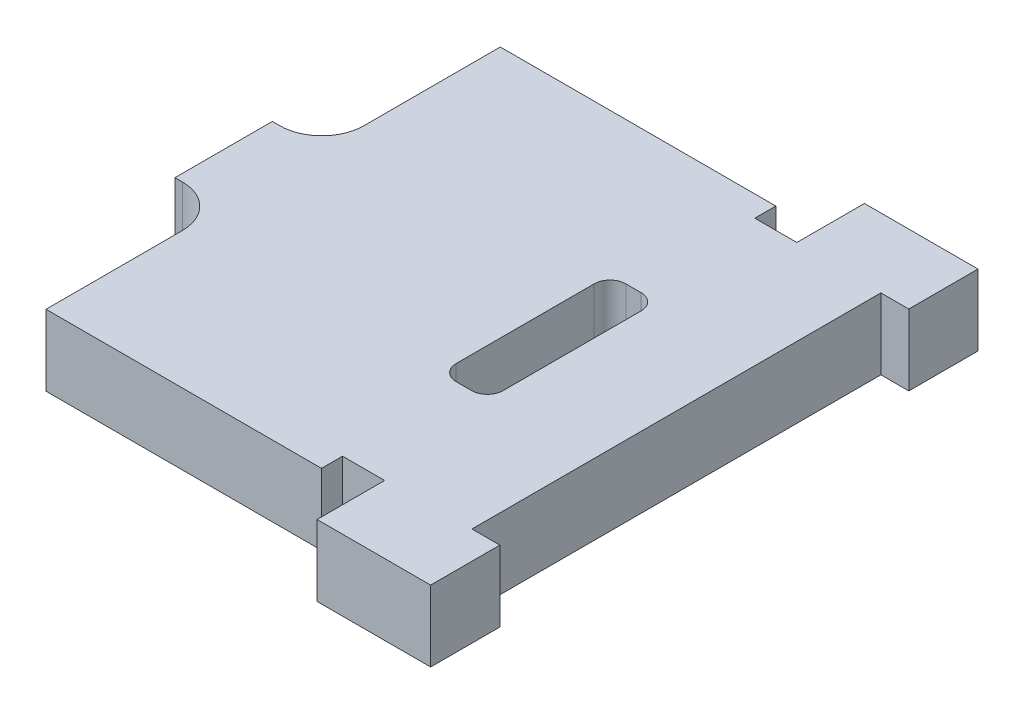
ISO-10303-21;
HEADER;
FILE_DESCRIPTION(('STEP AP214'),'2;1');
FILE_NAME('part.step','',(''),(''),'','','');
FILE_SCHEMA(('AUTOMOTIVE_DESIGN { 1 0 10303 214 1 1 1 1 }'));
ENDSEC;
DATA;
#1=APPLICATION_CONTEXT('core data for automotive mechanical design processes');
#2=APPLICATION_PROTOCOL_DEFINITION('international standard','automotive_design',2000,#1);
#3=PRODUCT_CONTEXT('',#1,'mechanical');
#4=PRODUCT('Part','Part','',(#3));
#5=PRODUCT_RELATED_PRODUCT_CATEGORY('part','',(#4));
#6=PRODUCT_DEFINITION_FORMATION('','',#4);
#7=PRODUCT_DEFINITION_CONTEXT('part definition',#1,'design');
#8=PRODUCT_DEFINITION('design','',#6,#7);
#9=PRODUCT_DEFINITION_SHAPE('','',#8);
#10=(LENGTH_UNIT() NAMED_UNIT(*) SI_UNIT(.MILLI.,.METRE.));
#11=(NAMED_UNIT(*) PLANE_ANGLE_UNIT() SI_UNIT($,.RADIAN.));
#12=(NAMED_UNIT(*) SI_UNIT($,.STERADIAN.) SOLID_ANGLE_UNIT());
#13=UNCERTAINTY_MEASURE_WITH_UNIT(LENGTH_MEASURE(1.E-05),#10,'distance_accuracy_value','');
#14=(GEOMETRIC_REPRESENTATION_CONTEXT(3) GLOBAL_UNCERTAINTY_ASSIGNED_CONTEXT((#13)) GLOBAL_UNIT_ASSIGNED_CONTEXT((#10,
#11,#12)) REPRESENTATION_CONTEXT('',''));
#15=CARTESIAN_POINT('',(0.,0.,0.));
#16=DIRECTION('',(0.,0.,1.));
#17=DIRECTION('',(1.,0.,0.));
#18=AXIS2_PLACEMENT_3D('',#15,#16,#17);
#19=CARTESIAN_POINT('',(0.4525,-0.767250000000002,-0.862923736910352));
#20=DIRECTION('',(0.,-1.,0.));
#21=DIRECTION('',(0.707106781186548,0.,0.707106781186548));
#22=AXIS2_PLACEMENT_3D('',#19,#20,#21);
#23=CYLINDRICAL_SURFACE('',#22,0.4);
#24=CARTESIAN_POINT('',(0.4525,-0.0922500000000012,-0.862923736910352));
#25=DIRECTION('',(0.,1.,0.));
#26=DIRECTION('',(0.707106781186548,0.,0.707106781186548));
#27=AXIS2_PLACEMENT_3D('',#24,#25,#26);
#28=CIRCLE('',#27,0.4);
#29=CARTESIAN_POINT('',(0.4525,-0.092250000000001,-0.462923736910352));
#30=VERTEX_POINT('',#29);
#31=CARTESIAN_POINT('',(0.8525,-0.0922500000000007,-0.862923736910352));
#32=VERTEX_POINT('',#31);
#33=EDGE_CURVE('E11',#30,#32,#28,.T.);
#34=ORIENTED_EDGE('',*,*,#33,.T.);
#35=DIRECTION('',(0.,-1.,0.));
#36=VECTOR('',#35,1.);
#37=CARTESIAN_POINT('',(0.8525,-0.767250000000001,-0.862923736910352));
#38=LINE('',#37,#36);
#39=CARTESIAN_POINT('',(0.8525,-0.767250000000001,-0.862923736910352));
#40=VERTEX_POINT('',#39);
#41=EDGE_CURVE('E24',#32,#40,#38,.T.);
#42=ORIENTED_EDGE('',*,*,#41,.T.);
#43=CARTESIAN_POINT('',(0.4525,-0.767250000000002,-0.862923736910352));
#44=DIRECTION('',(0.,-1.,0.));
#45=DIRECTION('',(0.707106781186548,0.,0.707106781186548));
#46=AXIS2_PLACEMENT_3D('',#43,#44,#45);
#47=CIRCLE('',#46,0.4);
#48=CARTESIAN_POINT('',(0.4525,-0.767250000000001,-0.462923736910352));
#49=VERTEX_POINT('',#48);
#50=EDGE_CURVE('E459',#40,#49,#47,.T.);
#51=ORIENTED_EDGE('',*,*,#50,.T.);
#52=DIRECTION('',(0.,1.,0.));
#53=VECTOR('',#52,1.);
#54=CARTESIAN_POINT('',(0.4525,-0.767250000000002,-0.462923736910352));
#55=LINE('',#54,#53);
#56=EDGE_CURVE('E36',#49,#30,#55,.T.);
#57=ORIENTED_EDGE('',*,*,#56,.T.);
#58=EDGE_LOOP('',(#34,#42,#51,#57));
#59=FACE_BOUND('',#58,.T.);
#60=ADVANCED_FACE('F17',(#59),#23,.F.);
#61=CARTESIAN_POINT('',(0.8525,-0.767250000000001,-2.16));
#62=DIRECTION('',(-1.,0.,0.));
#63=DIRECTION('',(0.,0.,1.));
#64=AXIS2_PLACEMENT_3D('',#61,#62,#63);
#65=PLANE('',#64);
#66=ORIENTED_EDGE('',*,*,#41,.F.);
#67=DIRECTION('',(0.,0.,1.));
#68=VECTOR('',#67,1.);
#69=CARTESIAN_POINT('',(0.8525,-0.0922500000000007,-1.08));
#70=LINE('',#69,#68);
#71=CARTESIAN_POINT('',(0.8525,-0.0922500000000008,-2.16));
#72=VERTEX_POINT('',#71);
#73=EDGE_CURVE('E455',#72,#32,#70,.T.);
#74=ORIENTED_EDGE('',*,*,#73,.F.);
#75=DIRECTION('',(0.,1.,0.));
#76=VECTOR('',#75,1.);
#77=CARTESIAN_POINT('',(0.8525,-0.767250000000001,-2.16));
#78=LINE('',#77,#76);
#79=CARTESIAN_POINT('',(0.8525,-0.767250000000001,-2.16));
#80=VERTEX_POINT('',#79);
#81=EDGE_CURVE('E452',#80,#72,#78,.T.);
#82=ORIENTED_EDGE('',*,*,#81,.F.);
#83=DIRECTION('',(0.,0.,-1.));
#84=VECTOR('',#83,1.);
#85=CARTESIAN_POINT('',(0.8525,-0.767250000000001,2.16));
#86=LINE('',#85,#84);
#87=EDGE_CURVE('E449',#40,#80,#86,.T.);
#88=ORIENTED_EDGE('',*,*,#87,.F.);
#89=EDGE_LOOP('',(#66,#74,#82,#88));
#90=FACE_BOUND('',#89,.T.);
#91=ADVANCED_FACE('F460',(#90),#65,.T.);
#92=CARTESIAN_POINT('',(0.4525,-0.767250000000001,0.862923736910352));
#93=DIRECTION('',(0.,1.,0.));
#94=DIRECTION('',(0.707106781186548,0.,-0.707106781186548));
#95=AXIS2_PLACEMENT_3D('',#92,#93,#94);
#96=CYLINDRICAL_SURFACE('',#95,0.4);
#97=CARTESIAN_POINT('',(0.4525,-0.767250000000002,0.862923736910352));
#98=DIRECTION('',(0.,-1.,0.));
#99=DIRECTION('',(0.707106781186548,0.,-0.707106781186548));
#100=AXIS2_PLACEMENT_3D('',#97,#98,#99);
#101=CIRCLE('',#100,0.4);
#102=CARTESIAN_POINT('',(0.4525,-0.767250000000001,0.462923736910352));
#103=VERTEX_POINT('',#102);
#104=CARTESIAN_POINT('',(0.8525,-0.767250000000001,0.862923736910352));
#105=VERTEX_POINT('',#104);
#106=EDGE_CURVE('E446',#103,#105,#101,.T.);
#107=ORIENTED_EDGE('',*,*,#106,.T.);
#108=DIRECTION('',(0.,1.,0.));
#109=VECTOR('',#108,1.);
#110=CARTESIAN_POINT('',(0.8525,-0.767250000000001,0.862923736910352));
#111=LINE('',#110,#109);
#112=CARTESIAN_POINT('',(0.8525,-0.0922500000000007,0.862923736910352));
#113=VERTEX_POINT('',#112);
#114=EDGE_CURVE('E443',#105,#113,#111,.T.);
#115=ORIENTED_EDGE('',*,*,#114,.T.);
#116=CARTESIAN_POINT('',(0.4525,-0.0922500000000012,0.862923736910352));
#117=DIRECTION('',(0.,1.,0.));
#118=DIRECTION('',(0.707106781186548,0.,-0.707106781186548));
#119=AXIS2_PLACEMENT_3D('',#116,#117,#118);
#120=CIRCLE('',#119,0.4);
#121=CARTESIAN_POINT('',(0.4525,-0.0922500000000009,0.462923736910352));
#122=VERTEX_POINT('',#121);
#123=EDGE_CURVE('E440',#113,#122,#120,.T.);
#124=ORIENTED_EDGE('',*,*,#123,.T.);
#125=DIRECTION('',(0.,-1.,0.));
#126=VECTOR('',#125,1.);
#127=CARTESIAN_POINT('',(0.4525,-0.767250000000001,0.462923736910352));
#128=LINE('',#127,#126);
#129=EDGE_CURVE('E438',#122,#103,#128,.T.);
#130=ORIENTED_EDGE('',*,*,#129,.T.);
#131=EDGE_LOOP('',(#107,#115,#124,#130));
#132=FACE_BOUND('',#131,.T.);
#133=ADVANCED_FACE('F493',(#132),#96,.F.);
#134=CARTESIAN_POINT('',(0.8525,-0.767250000000001,-2.16));
#135=DIRECTION('',(-1.,0.,0.));
#136=DIRECTION('',(0.,0.,1.));
#137=AXIS2_PLACEMENT_3D('',#134,#135,#136);
#138=PLANE('',#137);
#139=ORIENTED_EDGE('',*,*,#114,.F.);
#140=DIRECTION('',(0.,0.,-1.));
#141=VECTOR('',#140,1.);
#142=CARTESIAN_POINT('',(0.8525,-0.767250000000001,2.16));
#143=LINE('',#142,#141);
#144=CARTESIAN_POINT('',(0.8525,-0.767250000000001,2.16));
#145=VERTEX_POINT('',#144);
#146=EDGE_CURVE('E435',#145,#105,#143,.T.);
#147=ORIENTED_EDGE('',*,*,#146,.F.);
#148=DIRECTION('',(0.,1.,0.));
#149=VECTOR('',#148,1.);
#150=CARTESIAN_POINT('',(0.8525,-0.767250000000001,2.16));
#151=LINE('',#150,#149);
#152=CARTESIAN_POINT('',(0.8525,-0.0922500000000008,2.16));
#153=VERTEX_POINT('',#152);
#154=EDGE_CURVE('E433',#145,#153,#151,.T.);
#155=ORIENTED_EDGE('',*,*,#154,.T.);
#156=DIRECTION('',(0.,0.,1.));
#157=VECTOR('',#156,1.);
#158=CARTESIAN_POINT('',(0.8525,-0.0922500000000007,-1.08));
#159=LINE('',#158,#157);
#160=EDGE_CURVE('E430',#113,#153,#159,.T.);
#161=ORIENTED_EDGE('',*,*,#160,.F.);
#162=EDGE_LOOP('',(#139,#147,#155,#161));
#163=FACE_BOUND('',#162,.T.);
#164=ADVANCED_FACE('F496',(#163),#138,.T.);
#165=CARTESIAN_POINT('',(3.545609128039,-0.76725,-0.656218256077382));
#166=DIRECTION('',(0.,-1.,0.));
#167=DIRECTION('',(0.707106781186548,0.,-0.707106781186547));
#168=AXIS2_PLACEMENT_3D('',#165,#166,#167);
#169=CYLINDRICAL_SURFACE('',#168,0.15);
#170=CARTESIAN_POINT('',(3.545609128039,-0.0922499999999994,-0.656218256077382));
#171=DIRECTION('',(0.,1.,0.));
#172=DIRECTION('',(0.707106781186548,0.,-0.707106781186547));
#173=AXIS2_PLACEMENT_3D('',#170,#171,#172);
#174=CIRCLE('',#173,0.15);
#175=CARTESIAN_POINT('',(3.695609128039,-0.0922499999999993,-0.656218256077382));
#176=VERTEX_POINT('',#175);
#177=CARTESIAN_POINT('',(3.545609128039,-0.0922499999999994,-0.806218256077382));
#178=VERTEX_POINT('',#177);
#179=EDGE_CURVE('E427',#176,#178,#174,.T.);
#180=ORIENTED_EDGE('',*,*,#179,.T.);
#181=DIRECTION('',(0.,-1.,0.));
#182=VECTOR('',#181,1.);
#183=CARTESIAN_POINT('',(3.545609128039,-0.76725,-0.806218256077382));
#184=LINE('',#183,#182);
#185=CARTESIAN_POINT('',(3.545609128039,-0.76725,-0.806218256077382));
#186=VERTEX_POINT('',#185);
#187=EDGE_CURVE('E424',#178,#186,#184,.T.);
#188=ORIENTED_EDGE('',*,*,#187,.T.);
#189=CARTESIAN_POINT('',(3.545609128039,-0.76725,-0.656218256077382));
#190=DIRECTION('',(0.,-1.,0.));
#191=DIRECTION('',(0.707106781186548,0.,-0.707106781186547));
#192=AXIS2_PLACEMENT_3D('',#189,#190,#191);
#193=CIRCLE('',#192,0.15);
#194=CARTESIAN_POINT('',(3.695609128039,-0.76725,-0.656218256077382));
#195=VERTEX_POINT('',#194);
#196=EDGE_CURVE('E421',#186,#195,#193,.T.);
#197=ORIENTED_EDGE('',*,*,#196,.T.);
#198=DIRECTION('',(0.,1.,0.));
#199=VECTOR('',#198,1.);
#200=CARTESIAN_POINT('',(3.695609128039,-0.76725,-0.656218256077382));
#201=LINE('',#200,#199);
#202=EDGE_CURVE('E419',#195,#176,#201,.T.);
#203=ORIENTED_EDGE('',*,*,#202,.T.);
#204=EDGE_LOOP('',(#180,#188,#197,#203));
#205=FACE_BOUND('',#204,.T.);
#206=ADVANCED_FACE('F554',(#205),#169,.F.);
#207=CARTESIAN_POINT('',(3.249390871961,-0.76725,-0.806218256077382));
#208=DIRECTION('',(0.,0.,-1.));
#209=DIRECTION('',(1.,0.,0.));
#210=AXIS2_PLACEMENT_3D('',#207,#208,#209);
#211=PLANE('',#210);
#212=ORIENTED_EDGE('',*,*,#187,.F.);
#213=DIRECTION('',(1.,0.,0.));
#214=VECTOR('',#213,1.);
#215=CARTESIAN_POINT('',(4.100945435981,-0.0922499999999991,-0.806218256077382));
#216=LINE('',#215,#214);
#217=CARTESIAN_POINT('',(3.399390871961,-0.0922499999999994,-0.806218256077382));
#218=VERTEX_POINT('',#217);
#219=EDGE_CURVE('E416',#218,#178,#216,.T.);
#220=ORIENTED_EDGE('',*,*,#219,.F.);
#221=DIRECTION('',(0.,1.,0.));
#222=VECTOR('',#221,1.);
#223=CARTESIAN_POINT('',(3.399390871961,-0.76725,-0.806218256077382));
#224=LINE('',#223,#222);
#225=CARTESIAN_POINT('',(3.399390871961,-0.76725,-0.806218256077382));
#226=VERTEX_POINT('',#225);
#227=EDGE_CURVE('E413',#226,#218,#224,.T.);
#228=ORIENTED_EDGE('',*,*,#227,.F.);
#229=DIRECTION('',(-1.,0.,0.));
#230=VECTOR('',#229,1.);
#231=CARTESIAN_POINT('',(3.560945435981,-0.76725,-0.806218256077382));
#232=LINE('',#231,#230);
#233=EDGE_CURVE('E410',#186,#226,#232,.T.);
#234=ORIENTED_EDGE('',*,*,#233,.F.);
#235=EDGE_LOOP('',(#212,#220,#228,#234));
#236=FACE_BOUND('',#235,.T.);
#237=ADVANCED_FACE('F557',(#236),#211,.F.);
#238=CARTESIAN_POINT('',(3.399390871961,-0.76725,-0.656218256077382));
#239=DIRECTION('',(0.,1.,0.));
#240=DIRECTION('',(-0.707106781186548,0.,-0.707106781186548));
#241=AXIS2_PLACEMENT_3D('',#238,#239,#240);
#242=CYLINDRICAL_SURFACE('',#241,0.15);
#243=CARTESIAN_POINT('',(3.399390871961,-0.76725,-0.656218256077382));
#244=DIRECTION('',(0.,-1.,0.));
#245=DIRECTION('',(-0.707106781186548,0.,-0.707106781186548));
#246=AXIS2_PLACEMENT_3D('',#243,#244,#245);
#247=CIRCLE('',#246,0.15);
#248=CARTESIAN_POINT('',(3.249390871961,-0.76725,-0.656218256077382));
#249=VERTEX_POINT('',#248);
#250=EDGE_CURVE('E407',#249,#226,#247,.T.);
#251=ORIENTED_EDGE('',*,*,#250,.T.);
#252=ORIENTED_EDGE('',*,*,#227,.T.);
#253=CARTESIAN_POINT('',(3.399390871961,-0.0922499999999994,-0.656218256077382));
#254=DIRECTION('',(0.,1.,0.));
#255=DIRECTION('',(-0.707106781186548,0.,-0.707106781186548));
#256=AXIS2_PLACEMENT_3D('',#253,#254,#255);
#257=CIRCLE('',#256,0.15);
#258=CARTESIAN_POINT('',(3.249390871961,-0.0922499999999995,-0.656218256077382));
#259=VERTEX_POINT('',#258);
#260=EDGE_CURVE('E404',#218,#259,#257,.T.);
#261=ORIENTED_EDGE('',*,*,#260,.T.);
#262=DIRECTION('',(0.,-1.,0.));
#263=VECTOR('',#262,1.);
#264=CARTESIAN_POINT('',(3.249390871961,-0.76725,-0.656218256077382));
#265=LINE('',#264,#263);
#266=EDGE_CURVE('E402',#259,#249,#265,.T.);
#267=ORIENTED_EDGE('',*,*,#266,.T.);
#268=EDGE_LOOP('',(#251,#252,#261,#267));
#269=FACE_BOUND('',#268,.T.);
#270=ADVANCED_FACE('F561',(#269),#242,.F.);
#271=CARTESIAN_POINT('',(3.545609128039,-0.76725,0.656218256077382));
#272=DIRECTION('',(0.,-1.,0.));
#273=DIRECTION('',(0.707106781186548,0.,0.707106781186548));
#274=AXIS2_PLACEMENT_3D('',#271,#272,#273);
#275=CYLINDRICAL_SURFACE('',#274,0.15);
#276=CARTESIAN_POINT('',(3.545609128039,-0.0922499999999994,0.656218256077382));
#277=DIRECTION('',(0.,1.,0.));
#278=DIRECTION('',(0.707106781186548,0.,0.707106781186548));
#279=AXIS2_PLACEMENT_3D('',#276,#277,#278);
#280=CIRCLE('',#279,0.15);
#281=CARTESIAN_POINT('',(3.545609128039,-0.0922499999999993,0.806218256077382));
#282=VERTEX_POINT('',#281);
#283=CARTESIAN_POINT('',(3.695609128039,-0.0922499999999993,0.656218256077382));
#284=VERTEX_POINT('',#283);
#285=EDGE_CURVE('E399',#282,#284,#280,.T.);
#286=ORIENTED_EDGE('',*,*,#285,.T.);
#287=DIRECTION('',(0.,-1.,0.));
#288=VECTOR('',#287,1.);
#289=CARTESIAN_POINT('',(3.695609128039,-0.76725,0.656218256077382));
#290=LINE('',#289,#288);
#291=CARTESIAN_POINT('',(3.695609128039,-0.76725,0.656218256077382));
#292=VERTEX_POINT('',#291);
#293=EDGE_CURVE('E396',#284,#292,#290,.T.);
#294=ORIENTED_EDGE('',*,*,#293,.T.);
#295=CARTESIAN_POINT('',(3.545609128039,-0.76725,0.656218256077382));
#296=DIRECTION('',(0.,-1.,0.));
#297=DIRECTION('',(0.707106781186548,0.,0.707106781186548));
#298=AXIS2_PLACEMENT_3D('',#295,#296,#297);
#299=CIRCLE('',#298,0.15);
#300=CARTESIAN_POINT('',(3.545609128039,-0.76725,0.806218256077382));
#301=VERTEX_POINT('',#300);
#302=EDGE_CURVE('E393',#292,#301,#299,.T.);
#303=ORIENTED_EDGE('',*,*,#302,.T.);
#304=DIRECTION('',(0.,1.,0.));
#305=VECTOR('',#304,1.);
#306=CARTESIAN_POINT('',(3.545609128039,-0.76725,0.806218256077382));
#307=LINE('',#306,#305);
#308=EDGE_CURVE('E391',#301,#282,#307,.T.);
#309=ORIENTED_EDGE('',*,*,#308,.T.);
#310=EDGE_LOOP('',(#286,#294,#303,#309));
#311=FACE_BOUND('',#310,.T.);
#312=ADVANCED_FACE('F565',(#311),#275,.F.);
#313=CARTESIAN_POINT('',(3.695609128039,-0.76725,-0.806218256077382));
#314=DIRECTION('',(1.,0.,0.));
#315=DIRECTION('',(0.,0.,1.));
#316=AXIS2_PLACEMENT_3D('',#313,#314,#315);
#317=PLANE('',#316);
#318=ORIENTED_EDGE('',*,*,#202,.F.);
#319=DIRECTION('',(0.,0.,-1.));
#320=VECTOR('',#319,1.);
#321=CARTESIAN_POINT('',(3.695609128039,-0.76725,-0.403109128038691));
#322=LINE('',#321,#320);
#323=EDGE_CURVE('E388',#292,#195,#322,.T.);
#324=ORIENTED_EDGE('',*,*,#323,.F.);
#325=ORIENTED_EDGE('',*,*,#293,.F.);
#326=DIRECTION('',(0.,0.,1.));
#327=VECTOR('',#326,1.);
#328=CARTESIAN_POINT('',(3.695609128039,-0.0922499999999993,-0.403109128038691));
#329=LINE('',#328,#327);
#330=EDGE_CURVE('E385',#176,#284,#329,.T.);
#331=ORIENTED_EDGE('',*,*,#330,.F.);
#332=EDGE_LOOP('',(#318,#324,#325,#331));
#333=FACE_BOUND('',#332,.T.);
#334=ADVANCED_FACE('F569',(#333),#317,.F.);
#335=CARTESIAN_POINT('',(3.399390871961,-0.76725,0.656218256077382));
#336=DIRECTION('',(0.,-1.,0.));
#337=DIRECTION('',(-0.707106781186548,0.,0.707106781186547));
#338=AXIS2_PLACEMENT_3D('',#335,#336,#337);
#339=CYLINDRICAL_SURFACE('',#338,0.15);
#340=CARTESIAN_POINT('',(3.399390871961,-0.0922499999999994,0.656218256077382));
#341=DIRECTION('',(0.,1.,0.));
#342=DIRECTION('',(-0.707106781186548,0.,0.707106781186547));
#343=AXIS2_PLACEMENT_3D('',#340,#341,#342);
#344=CIRCLE('',#343,0.15);
#345=CARTESIAN_POINT('',(3.249390871961,-0.0922499999999995,0.656218256077382));
#346=VERTEX_POINT('',#345);
#347=CARTESIAN_POINT('',(3.399390871961,-0.0922499999999994,0.806218256077382));
#348=VERTEX_POINT('',#347);
#349=EDGE_CURVE('E382',#346,#348,#344,.T.);
#350=ORIENTED_EDGE('',*,*,#349,.T.);
#351=DIRECTION('',(0.,-1.,0.));
#352=VECTOR('',#351,1.);
#353=CARTESIAN_POINT('',(3.399390871961,-0.76725,0.806218256077382));
#354=LINE('',#353,#352);
#355=CARTESIAN_POINT('',(3.399390871961,-0.76725,0.806218256077382));
#356=VERTEX_POINT('',#355);
#357=EDGE_CURVE('E379',#348,#356,#354,.T.);
#358=ORIENTED_EDGE('',*,*,#357,.T.);
#359=CARTESIAN_POINT('',(3.399390871961,-0.76725,0.656218256077382));
#360=DIRECTION('',(0.,-1.,0.));
#361=DIRECTION('',(-0.707106781186548,0.,0.707106781186547));
#362=AXIS2_PLACEMENT_3D('',#359,#360,#361);
#363=CIRCLE('',#362,0.15);
#364=CARTESIAN_POINT('',(3.249390871961,-0.76725,0.656218256077382));
#365=VERTEX_POINT('',#364);
#366=EDGE_CURVE('E376',#356,#365,#363,.T.);
#367=ORIENTED_EDGE('',*,*,#366,.T.);
#368=DIRECTION('',(0.,1.,0.));
#369=VECTOR('',#368,1.);
#370=CARTESIAN_POINT('',(3.249390871961,-0.76725,0.656218256077382));
#371=LINE('',#370,#369);
#372=EDGE_CURVE('E374',#365,#346,#371,.T.);
#373=ORIENTED_EDGE('',*,*,#372,.T.);
#374=EDGE_LOOP('',(#350,#358,#367,#373));
#375=FACE_BOUND('',#374,.T.);
#376=ADVANCED_FACE('F573',(#375),#339,.F.);
#377=CARTESIAN_POINT('',(3.695609128039,-0.76725,0.806218256077382));
#378=DIRECTION('',(0.,0.,1.));
#379=DIRECTION('',(-1.,0.,0.));
#380=AXIS2_PLACEMENT_3D('',#377,#378,#379);
#381=PLANE('',#380);
#382=ORIENTED_EDGE('',*,*,#308,.F.);
#383=DIRECTION('',(1.,0.,0.));
#384=VECTOR('',#383,1.);
#385=CARTESIAN_POINT('',(3.784054564019,-0.76725,0.806218256077382));
#386=LINE('',#385,#384);
#387=EDGE_CURVE('E371',#356,#301,#386,.T.);
#388=ORIENTED_EDGE('',*,*,#387,.F.);
#389=ORIENTED_EDGE('',*,*,#357,.F.);
#390=DIRECTION('',(-1.,0.,0.));
#391=VECTOR('',#390,1.);
#392=CARTESIAN_POINT('',(4.324054564019,-0.092249999999999,0.806218256077382));
#393=LINE('',#392,#391);
#394=EDGE_CURVE('E368',#282,#348,#393,.T.);
#395=ORIENTED_EDGE('',*,*,#394,.F.);
#396=EDGE_LOOP('',(#382,#388,#389,#395));
#397=FACE_BOUND('',#396,.T.);
#398=ADVANCED_FACE('F577',(#397),#381,.F.);
#399=CARTESIAN_POINT('',(3.249390871961,-0.76725,0.806218256077382));
#400=DIRECTION('',(-1.,0.,0.));
#401=DIRECTION('',(0.,0.,-1.));
#402=AXIS2_PLACEMENT_3D('',#399,#400,#401);
#403=PLANE('',#402);
#404=ORIENTED_EDGE('',*,*,#266,.F.);
#405=DIRECTION('',(0.,0.,-1.));
#406=VECTOR('',#405,1.);
#407=CARTESIAN_POINT('',(3.249390871961,-0.0922499999999995,0.403109128038691));
#408=LINE('',#407,#406);
#409=EDGE_CURVE('E365',#346,#259,#408,.T.);
#410=ORIENTED_EDGE('',*,*,#409,.F.);
#411=ORIENTED_EDGE('',*,*,#372,.F.);
#412=DIRECTION('',(0.,0.,1.));
#413=VECTOR('',#412,1.);
#414=CARTESIAN_POINT('',(3.249390871961,-0.76725,0.403109128038691));
#415=LINE('',#414,#413);
#416=EDGE_CURVE('E362',#249,#365,#415,.T.);
#417=ORIENTED_EDGE('',*,*,#416,.F.);
#418=EDGE_LOOP('',(#404,#410,#411,#417));
#419=FACE_BOUND('',#418,.T.);
#420=ADVANCED_FACE('F581',(#419),#403,.F.);
#421=CARTESIAN_POINT('',(3.4725,-0.76725,-1.96));
#422=DIRECTION('',(-1.,0.,0.));
#423=DIRECTION('',(0.,0.,-1.));
#424=AXIS2_PLACEMENT_3D('',#421,#422,#423);
#425=PLANE('',#424);
#426=DIRECTION('',(0.,0.,-1.));
#427=VECTOR('',#426,1.);
#428=CARTESIAN_POINT('',(3.4725,-0.0922499999999994,-0.98));
#429=LINE('',#428,#427);
#430=CARTESIAN_POINT('',(3.4725,-0.0922499999999994,-1.96));
#431=VERTEX_POINT('',#430);
#432=CARTESIAN_POINT('',(3.4725,-0.0922499999999994,-2.16));
#433=VERTEX_POINT('',#432);
#434=EDGE_CURVE('E360',#431,#433,#429,.T.);
#435=ORIENTED_EDGE('',*,*,#434,.F.);
#436=DIRECTION('',(0.,-1.,0.));
#437=VECTOR('',#436,1.);
#438=CARTESIAN_POINT('',(3.4725,-0.76725,-1.96));
#439=LINE('',#438,#437);
#440=CARTESIAN_POINT('',(3.4725,-0.76725,-1.96));
#441=VERTEX_POINT('',#440);
#442=EDGE_CURVE('E358',#431,#441,#439,.T.);
#443=ORIENTED_EDGE('',*,*,#442,.T.);
#444=DIRECTION('',(0.,0.,1.));
#445=VECTOR('',#444,1.);
#446=CARTESIAN_POINT('',(3.4725,-0.76725,-0.98));
#447=LINE('',#446,#445);
#448=CARTESIAN_POINT('',(3.4725,-0.76725,-2.16));
#449=VERTEX_POINT('',#448);
#450=EDGE_CURVE('E355',#449,#441,#447,.T.);
#451=ORIENTED_EDGE('',*,*,#450,.F.);
#452=DIRECTION('',(0.,-1.,0.));
#453=VECTOR('',#452,1.);
#454=CARTESIAN_POINT('',(3.4725,-0.76725,-2.16));
#455=LINE('',#454,#453);
#456=EDGE_CURVE('E352',#433,#449,#455,.T.);
#457=ORIENTED_EDGE('',*,*,#456,.F.);
#458=EDGE_LOOP('',(#435,#443,#451,#457));
#459=FACE_BOUND('',#458,.T.);
#460=ADVANCED_FACE('F470',(#459),#425,.F.);
#461=CARTESIAN_POINT('',(3.8725,-0.76725,-1.96));
#462=DIRECTION('',(0.,0.,1.));
#463=DIRECTION('',(-1.,0.,0.));
#464=AXIS2_PLACEMENT_3D('',#461,#462,#463);
#465=PLANE('',#464);
#466=DIRECTION('',(-1.,0.,0.));
#467=VECTOR('',#466,1.);
#468=CARTESIAN_POINT('',(4.4125,-0.0922499999999989,-1.96));
#469=LINE('',#468,#467);
#470=CARTESIAN_POINT('',(3.8725,-0.0922499999999991,-1.96));
#471=VERTEX_POINT('',#470);
#472=EDGE_CURVE('E349',#471,#431,#469,.T.);
#473=ORIENTED_EDGE('',*,*,#472,.F.);
#474=DIRECTION('',(0.,-1.,0.));
#475=VECTOR('',#474,1.);
#476=CARTESIAN_POINT('',(3.8725,-0.76725,-1.96));
#477=LINE('',#476,#475);
#478=CARTESIAN_POINT('',(3.8725,-0.76725,-1.96));
#479=VERTEX_POINT('',#478);
#480=EDGE_CURVE('E347',#471,#479,#477,.T.);
#481=ORIENTED_EDGE('',*,*,#480,.T.);
#482=DIRECTION('',(1.,0.,0.));
#483=VECTOR('',#482,1.);
#484=CARTESIAN_POINT('',(3.8725,-0.76725,-1.96));
#485=LINE('',#484,#483);
#486=EDGE_CURVE('E344',#441,#479,#485,.T.);
#487=ORIENTED_EDGE('',*,*,#486,.F.);
#488=ORIENTED_EDGE('',*,*,#442,.F.);
#489=EDGE_LOOP('',(#473,#481,#487,#488));
#490=FACE_BOUND('',#489,.T.);
#491=ADVANCED_FACE('F475',(#490),#465,.F.);
#492=CARTESIAN_POINT('',(3.4725,-0.76725,2.36));
#493=DIRECTION('',(-1.,0.,0.));
#494=DIRECTION('',(0.,0.,-1.));
#495=AXIS2_PLACEMENT_3D('',#492,#493,#494);
#496=PLANE('',#495);
#497=DIRECTION('',(0.,0.,1.));
#498=VECTOR('',#497,1.);
#499=CARTESIAN_POINT('',(3.4725,-0.76725,1.18));
#500=LINE('',#499,#498);
#501=CARTESIAN_POINT('',(3.4725,-0.76725,1.96));
#502=VERTEX_POINT('',#501);
#503=CARTESIAN_POINT('',(3.4725,-0.76725,2.16));
#504=VERTEX_POINT('',#503);
#505=EDGE_CURVE('E342',#502,#504,#500,.T.);
#506=ORIENTED_EDGE('',*,*,#505,.F.);
#507=DIRECTION('',(0.,1.,0.));
#508=VECTOR('',#507,1.);
#509=CARTESIAN_POINT('',(3.4725,-0.76725,1.96));
#510=LINE('',#509,#508);
#511=CARTESIAN_POINT('',(3.4725,-0.0922499999999994,1.96));
#512=VERTEX_POINT('',#511);
#513=EDGE_CURVE('E340',#502,#512,#510,.T.);
#514=ORIENTED_EDGE('',*,*,#513,.T.);
#515=DIRECTION('',(0.,0.,-1.));
#516=VECTOR('',#515,1.);
#517=CARTESIAN_POINT('',(3.4725,-0.0922499999999994,1.18));
#518=LINE('',#517,#516);
#519=CARTESIAN_POINT('',(3.4725,-0.0922499999999994,2.16));
#520=VERTEX_POINT('',#519);
#521=EDGE_CURVE('E337',#520,#512,#518,.T.);
#522=ORIENTED_EDGE('',*,*,#521,.F.);
#523=DIRECTION('',(0.,1.,0.));
#524=VECTOR('',#523,1.);
#525=CARTESIAN_POINT('',(3.4725,-0.76725,2.16));
#526=LINE('',#525,#524);
#527=EDGE_CURVE('E334',#504,#520,#526,.T.);
#528=ORIENTED_EDGE('',*,*,#527,.F.);
#529=EDGE_LOOP('',(#506,#514,#522,#528));
#530=FACE_BOUND('',#529,.T.);
#531=ADVANCED_FACE('F504',(#530),#496,.F.);
#532=CARTESIAN_POINT('',(3.4725,-0.76725,1.96));
#533=DIRECTION('',(0.,0.,-1.));
#534=DIRECTION('',(1.,0.,0.));
#535=AXIS2_PLACEMENT_3D('',#532,#533,#534);
#536=PLANE('',#535);
#537=DIRECTION('',(-1.,0.,0.));
#538=VECTOR('',#537,1.);
#539=CARTESIAN_POINT('',(3.6725,-0.76725,1.96));
#540=LINE('',#539,#538);
#541=CARTESIAN_POINT('',(3.8725,-0.76725,1.96));
#542=VERTEX_POINT('',#541);
#543=EDGE_CURVE('E331',#542,#502,#540,.T.);
#544=ORIENTED_EDGE('',*,*,#543,.F.);
#545=DIRECTION('',(0.,-1.,0.));
#546=VECTOR('',#545,1.);
#547=CARTESIAN_POINT('',(3.8725,-0.76725,1.96));
#548=LINE('',#547,#546);
#549=CARTESIAN_POINT('',(3.8725,-0.0922499999999991,1.96));
#550=VERTEX_POINT('',#549);
#551=EDGE_CURVE('E328',#550,#542,#548,.T.);
#552=ORIENTED_EDGE('',*,*,#551,.F.);
#553=DIRECTION('',(1.,0.,0.));
#554=VECTOR('',#553,1.);
#555=CARTESIAN_POINT('',(4.2125,-0.0922499999999991,1.96));
#556=LINE('',#555,#554);
#557=EDGE_CURVE('E325',#512,#550,#556,.T.);
#558=ORIENTED_EDGE('',*,*,#557,.F.);
#559=ORIENTED_EDGE('',*,*,#513,.F.);
#560=EDGE_LOOP('',(#544,#552,#558,#559));
#561=FACE_BOUND('',#560,.T.);
#562=ADVANCED_FACE('F509',(#561),#536,.F.);
#563=CARTESIAN_POINT('',(3.8725,-0.76725,-2.16));
#564=DIRECTION('',(0.,0.,-1.));
#565=DIRECTION('',(-1.,0.,0.));
#566=AXIS2_PLACEMENT_3D('',#563,#564,#565);
#567=PLANE('',#566);
#568=ORIENTED_EDGE('',*,*,#456,.T.);
#569=DIRECTION('',(1.,0.,0.));
#570=VECTOR('',#569,1.);
#571=CARTESIAN_POINT('',(0.8525,-0.767250000000001,-2.16));
#572=LINE('',#571,#570);
#573=EDGE_CURVE('E322',#80,#449,#572,.T.);
#574=ORIENTED_EDGE('',*,*,#573,.F.);
#575=ORIENTED_EDGE('',*,*,#81,.T.);
#576=DIRECTION('',(-1.,0.,0.));
#577=VECTOR('',#576,1.);
#578=CARTESIAN_POINT('',(2.999853019961,-0.0922499999999997,-2.16));
#579=LINE('',#578,#577);
#580=EDGE_CURVE('E319',#433,#72,#579,.T.);
#581=ORIENTED_EDGE('',*,*,#580,.F.);
#582=EDGE_LOOP('',(#568,#574,#575,#581));
#583=FACE_BOUND('',#582,.T.);
#584=ADVANCED_FACE('F466',(#583),#567,.T.);
#585=CARTESIAN_POINT('',(3.8725,-0.0922499999999993,0.));
#586=DIRECTION('',(-1.,0.,0.));
#587=DIRECTION('',(0.,-1.,0.));
#588=AXIS2_PLACEMENT_3D('',#585,#586,#587);
#589=PLANE('',#588);
#590=DIRECTION('',(0.,0.,1.));
#591=VECTOR('',#590,1.);
#592=CARTESIAN_POINT('',(3.8725,-0.0922499999999992,-1.18));
#593=LINE('',#592,#591);
#594=CARTESIAN_POINT('',(3.8725,-0.0922499999999993,-2.6025));
#595=VERTEX_POINT('',#594);
#596=EDGE_CURVE('E317',#595,#471,#593,.T.);
#597=ORIENTED_EDGE('',*,*,#596,.F.);
#598=DIRECTION('',(0.,1.,0.));
#599=VECTOR('',#598,1.);
#600=CARTESIAN_POINT('',(3.8725,-0.0922499999999993,-2.6025));
#601=LINE('',#600,#599);
#602=CARTESIAN_POINT('',(3.8725,-0.76725,-2.6025));
#603=VERTEX_POINT('',#602);
#604=EDGE_CURVE('E228',#603,#595,#601,.T.);
#605=ORIENTED_EDGE('',*,*,#604,.F.);
#606=DIRECTION('',(0.,0.,1.));
#607=VECTOR('',#606,1.);
#608=CARTESIAN_POINT('',(3.8725,-0.76725,0.));
#609=LINE('',#608,#607);
#610=EDGE_CURVE('E313',#603,#479,#609,.T.);
#611=ORIENTED_EDGE('',*,*,#610,.T.);
#612=ORIENTED_EDGE('',*,*,#480,.F.);
#613=EDGE_LOOP('',(#597,#605,#611,#612));
#614=FACE_BOUND('',#613,.T.);
#615=ADVANCED_FACE('F478',(#614),#589,.T.);
#616=CARTESIAN_POINT('',(0.8525,-0.767250000000001,2.16));
#617=DIRECTION('',(0.,0.,1.));
#618=DIRECTION('',(1.,0.,0.));
#619=AXIS2_PLACEMENT_3D('',#616,#617,#618);
#620=PLANE('',#619);
#621=ORIENTED_EDGE('',*,*,#527,.T.);
#622=DIRECTION('',(1.,0.,0.));
#623=VECTOR('',#622,1.);
#624=CARTESIAN_POINT('',(1.489853019961,-0.0922500000000005,2.16));
#625=LINE('',#624,#623);
#626=EDGE_CURVE('E310',#153,#520,#625,.T.);
#627=ORIENTED_EDGE('',*,*,#626,.F.);
#628=ORIENTED_EDGE('',*,*,#154,.F.);
#629=DIRECTION('',(-1.,0.,0.));
#630=VECTOR('',#629,1.);
#631=CARTESIAN_POINT('',(3.8725,-0.76725,2.16));
#632=LINE('',#631,#630);
#633=EDGE_CURVE('E307',#504,#145,#632,.T.);
#634=ORIENTED_EDGE('',*,*,#633,.F.);
#635=EDGE_LOOP('',(#621,#627,#628,#634));
#636=FACE_BOUND('',#635,.T.);
#637=ADVANCED_FACE('F500',(#636),#620,.T.);
#638=CARTESIAN_POINT('',(3.8725,-0.0922499999999993,0.));
#639=DIRECTION('',(-1.,0.,0.));
#640=DIRECTION('',(0.,-1.,0.));
#641=AXIS2_PLACEMENT_3D('',#638,#639,#640);
#642=PLANE('',#641);
#643=DIRECTION('',(0.,0.,1.));
#644=VECTOR('',#643,1.);
#645=CARTESIAN_POINT('',(3.8725,-0.76725,0.));
#646=LINE('',#645,#644);
#647=CARTESIAN_POINT('',(3.8725,-0.76725,2.6025));
#648=VERTEX_POINT('',#647);
#649=EDGE_CURVE('E305',#542,#648,#646,.T.);
#650=ORIENTED_EDGE('',*,*,#649,.T.);
#651=DIRECTION('',(0.,-1.,0.));
#652=VECTOR('',#651,1.);
#653=CARTESIAN_POINT('',(3.8725,-0.0922499999999993,2.6025));
#654=LINE('',#653,#652);
#655=CARTESIAN_POINT('',(3.8725,-0.0922499999999993,2.6025));
#656=VERTEX_POINT('',#655);
#657=EDGE_CURVE('E302',#656,#648,#654,.T.);
#658=ORIENTED_EDGE('',*,*,#657,.F.);
#659=DIRECTION('',(0.,0.,1.));
#660=VECTOR('',#659,1.);
#661=CARTESIAN_POINT('',(3.8725,-0.0922499999999992,0.));
#662=LINE('',#661,#660);
#663=EDGE_CURVE('E299',#550,#656,#662,.T.);
#664=ORIENTED_EDGE('',*,*,#663,.F.);
#665=ORIENTED_EDGE('',*,*,#551,.T.);
#666=EDGE_LOOP('',(#650,#658,#664,#665));
#667=FACE_BOUND('',#666,.T.);
#668=ADVANCED_FACE('F512',(#667),#642,.T.);
#669=CARTESIAN_POINT('',(3.8725,-0.76725,0.));
#670=DIRECTION('',(0.,-1.,0.));
#671=DIRECTION('',(1.,0.,0.));
#672=AXIS2_PLACEMENT_3D('',#669,#670,#671);
#673=PLANE('',#672);
#674=ORIENTED_EDGE('',*,*,#450,.T.);
#675=ORIENTED_EDGE('',*,*,#486,.T.);
#676=ORIENTED_EDGE('',*,*,#610,.F.);
#677=DIRECTION('',(-1.,0.,0.));
#678=VECTOR('',#677,1.);
#679=CARTESIAN_POINT('',(3.8725,-0.76725,-2.6025));
#680=LINE('',#679,#678);
#681=CARTESIAN_POINT('',(4.9525,-0.767249999999999,-2.6025));
#682=VERTEX_POINT('',#681);
#683=EDGE_CURVE('E297',#682,#603,#680,.T.);
#684=ORIENTED_EDGE('',*,*,#683,.F.);
#685=DIRECTION('',(0.,0.,-1.));
#686=VECTOR('',#685,1.);
#687=CARTESIAN_POINT('',(4.9525,-0.767249999999999,0.));
#688=LINE('',#687,#686);
#689=CARTESIAN_POINT('',(4.9525,-0.767249999999999,-1.944279695023));
#690=VERTEX_POINT('',#689);
#691=EDGE_CURVE('E219',#690,#682,#688,.T.);
#692=ORIENTED_EDGE('',*,*,#691,.F.);
#693=DIRECTION('',(-1.,0.,0.));
#694=VECTOR('',#693,1.);
#695=CARTESIAN_POINT('',(4.545198580106,-0.767249999999999,-1.944279695023));
#696=LINE('',#695,#694);
#697=CARTESIAN_POINT('',(4.687102839789,-0.767249999999999,-1.944279695023));
#698=VERTEX_POINT('',#697);
#699=EDGE_CURVE('E294',#690,#698,#696,.T.);
#700=ORIENTED_EDGE('',*,*,#699,.T.);
#701=DIRECTION('',(0.,0.,1.));
#702=VECTOR('',#701,1.);
#703=CARTESIAN_POINT('',(4.687102839789,-0.767249999999999,-0.97213984751174));
#704=LINE('',#703,#702);
#705=CARTESIAN_POINT('',(4.687102839789,-0.767249999999999,1.944279695023));
#706=VERTEX_POINT('',#705);
#707=EDGE_CURVE('E292',#698,#706,#704,.T.);
#708=ORIENTED_EDGE('',*,*,#707,.T.);
#709=DIRECTION('',(1.,0.,0.));
#710=VECTOR('',#709,1.);
#711=CARTESIAN_POINT('',(4.279801419894,-0.767249999999999,1.944279695023));
#712=LINE('',#711,#710);
#713=CARTESIAN_POINT('',(4.9525,-0.767249999999999,1.944279695023));
#714=VERTEX_POINT('',#713);
#715=EDGE_CURVE('E290',#706,#714,#712,.T.);
#716=ORIENTED_EDGE('',*,*,#715,.T.);
#717=DIRECTION('',(0.,0.,-1.));
#718=VECTOR('',#717,1.);
#719=CARTESIAN_POINT('',(4.9525,-0.767249999999999,0.));
#720=LINE('',#719,#718);
#721=CARTESIAN_POINT('',(4.9525,-0.767249999999999,2.6025));
#722=VERTEX_POINT('',#721);
#723=EDGE_CURVE('E287',#722,#714,#720,.T.);
#724=ORIENTED_EDGE('',*,*,#723,.F.);
#725=DIRECTION('',(1.,0.,0.));
#726=VECTOR('',#725,1.);
#727=CARTESIAN_POINT('',(3.8725,-0.76725,2.6025));
#728=LINE('',#727,#726);
#729=EDGE_CURVE('E284',#648,#722,#728,.T.);
#730=ORIENTED_EDGE('',*,*,#729,.F.);
#731=ORIENTED_EDGE('',*,*,#649,.F.);
#732=ORIENTED_EDGE('',*,*,#543,.T.);
#733=ORIENTED_EDGE('',*,*,#505,.T.);
#734=ORIENTED_EDGE('',*,*,#633,.T.);
#735=ORIENTED_EDGE('',*,*,#146,.T.);
#736=ORIENTED_EDGE('',*,*,#106,.F.);
#737=DIRECTION('',(-1.,0.,0.));
#738=VECTOR('',#737,1.);
#739=CARTESIAN_POINT('',(1.323087920158,-0.767250000000001,0.462923736910352));
#740=LINE('',#739,#738);
#741=CARTESIAN_POINT('',(0.381912079842359,-0.767250000000001,0.462923736910352));
#742=VERTEX_POINT('',#741);
#743=EDGE_CURVE('E282',#103,#742,#740,.T.);
#744=ORIENTED_EDGE('',*,*,#743,.T.);
#745=DIRECTION('',(0.,0.,-1.));
#746=VECTOR('',#745,1.);
#747=CARTESIAN_POINT('',(0.381912079842359,-0.767250000000001,0.462923736910352));
#748=LINE('',#747,#746);
#749=CARTESIAN_POINT('',(0.381912079842359,-0.767250000000001,-0.462923736910352));
#750=VERTEX_POINT('',#749);
#751=EDGE_CURVE('E280',#742,#750,#748,.T.);
#752=ORIENTED_EDGE('',*,*,#751,.T.);
#753=DIRECTION('',(1.,0.,0.));
#754=VECTOR('',#753,1.);
#755=CARTESIAN_POINT('',(0.381912079842359,-0.767250000000001,-0.462923736910352));
#756=LINE('',#755,#754);
#757=EDGE_CURVE('E277',#750,#49,#756,.T.);
#758=ORIENTED_EDGE('',*,*,#757,.T.);
#759=ORIENTED_EDGE('',*,*,#50,.F.);
#760=ORIENTED_EDGE('',*,*,#87,.T.);
#761=ORIENTED_EDGE('',*,*,#573,.T.);
#762=EDGE_LOOP('',(#674,#675,#676,#684,#692,#700,#708,#716,#724,#730,#731,#732,#733,#734,#735,
#736,#744,#752,#758,#759,#760,#761));
#763=FACE_BOUND('',#762,.T.);
#764=ORIENTED_EDGE('',*,*,#416,.T.);
#765=ORIENTED_EDGE('',*,*,#366,.F.);
#766=ORIENTED_EDGE('',*,*,#387,.T.);
#767=ORIENTED_EDGE('',*,*,#302,.F.);
#768=ORIENTED_EDGE('',*,*,#323,.T.);
#769=ORIENTED_EDGE('',*,*,#196,.F.);
#770=ORIENTED_EDGE('',*,*,#233,.T.);
#771=ORIENTED_EDGE('',*,*,#250,.F.);
#772=EDGE_LOOP('',(#764,#765,#766,#767,#768,#769,#770,#771));
#773=FACE_BOUND('',#772,.T.);
#774=ADVANCED_FACE('F463',(#763,#773),#673,.T.);
#775=CARTESIAN_POINT('',(0.381912079842359,-0.767250000000001,0.462923736910352));
#776=DIRECTION('',(0.,0.,1.));
#777=DIRECTION('',(1.,0.,0.));
#778=AXIS2_PLACEMENT_3D('',#775,#776,#777);
#779=PLANE('',#778);
#780=ORIENTED_EDGE('',*,*,#129,.F.);
#781=DIRECTION('',(1.,0.,0.));
#782=VECTOR('',#781,1.);
#783=CARTESIAN_POINT('',(1.254559059882,-0.0922500000000005,0.462923736910352));
#784=LINE('',#783,#782);
#785=CARTESIAN_POINT('',(0.381912079842359,-0.0922500000000009,0.462923736910352));
#786=VERTEX_POINT('',#785);
#787=EDGE_CURVE('E274',#786,#122,#784,.T.);
#788=ORIENTED_EDGE('',*,*,#787,.F.);
#789=DIRECTION('',(0.,1.,0.));
#790=VECTOR('',#789,1.);
#791=CARTESIAN_POINT('',(0.381912079842359,-0.767250000000001,0.462923736910352));
#792=LINE('',#791,#790);
#793=EDGE_CURVE('E271',#742,#786,#792,.T.);
#794=ORIENTED_EDGE('',*,*,#793,.F.);
#795=ORIENTED_EDGE('',*,*,#743,.F.);
#796=EDGE_LOOP('',(#780,#788,#794,#795));
#797=FACE_BOUND('',#796,.T.);
#798=ADVANCED_FACE('F489',(#797),#779,.T.);
#799=CARTESIAN_POINT('',(0.381912079842359,-0.767250000000001,-0.462923736910352));
#800=DIRECTION('',(-1.,0.,0.));
#801=DIRECTION('',(0.,0.,1.));
#802=AXIS2_PLACEMENT_3D('',#799,#800,#801);
#803=PLANE('',#802);
#804=DIRECTION('',(0.,0.,1.));
#805=VECTOR('',#804,1.);
#806=CARTESIAN_POINT('',(0.381912079842359,-0.092250000000001,-0.231461868455176));
#807=LINE('',#806,#805);
#808=CARTESIAN_POINT('',(0.381912079842359,-0.0922500000000009,-0.462923736910352));
#809=VERTEX_POINT('',#808);
#810=EDGE_CURVE('E268',#809,#786,#807,.T.);
#811=ORIENTED_EDGE('',*,*,#810,.F.);
#812=DIRECTION('',(0.,1.,0.));
#813=VECTOR('',#812,1.);
#814=CARTESIAN_POINT('',(0.381912079842359,-0.767250000000001,-0.462923736910352));
#815=LINE('',#814,#813);
#816=EDGE_CURVE('E265',#750,#809,#815,.T.);
#817=ORIENTED_EDGE('',*,*,#816,.F.);
#818=ORIENTED_EDGE('',*,*,#751,.F.);
#819=ORIENTED_EDGE('',*,*,#793,.T.);
#820=EDGE_LOOP('',(#811,#817,#818,#819));
#821=FACE_BOUND('',#820,.T.);
#822=ADVANCED_FACE('F486',(#821),#803,.T.);
#823=CARTESIAN_POINT('',(1.323087920158,-0.767250000000001,-0.462923736910352));
#824=DIRECTION('',(0.,0.,-1.));
#825=DIRECTION('',(-1.,0.,0.));
#826=AXIS2_PLACEMENT_3D('',#823,#824,#825);
#827=PLANE('',#826);
#828=ORIENTED_EDGE('',*,*,#56,.F.);
#829=ORIENTED_EDGE('',*,*,#757,.F.);
#830=ORIENTED_EDGE('',*,*,#816,.T.);
#831=DIRECTION('',(-1.,0.,0.));
#832=VECTOR('',#831,1.);
#833=CARTESIAN_POINT('',(1.725146980039,-0.0922500000000003,-0.462923736910352));
#834=LINE('',#833,#832);
#835=EDGE_CURVE('E262',#30,#809,#834,.T.);
#836=ORIENTED_EDGE('',*,*,#835,.F.);
#837=EDGE_LOOP('',(#828,#829,#830,#836));
#838=FACE_BOUND('',#837,.T.);
#839=ADVANCED_FACE('F481',(#838),#827,.T.);
#840=CARTESIAN_POINT('',(4.687102839789,-0.0922499999999988,1.944279695023));
#841=DIRECTION('',(0.,0.,1.));
#842=DIRECTION('',(1.,0.,0.));
#843=AXIS2_PLACEMENT_3D('',#840,#841,#842);
#844=PLANE('',#843);
#845=ORIENTED_EDGE('',*,*,#715,.F.);
#846=DIRECTION('',(0.,1.,0.));
#847=VECTOR('',#846,1.);
#848=CARTESIAN_POINT('',(4.687102839789,-0.0922499999999988,1.944279695023));
#849=LINE('',#848,#847);
#850=CARTESIAN_POINT('',(4.687102839789,-0.0922499999999988,1.944279695023));
#851=VERTEX_POINT('',#850);
#852=EDGE_CURVE('E260',#706,#851,#849,.T.);
#853=ORIENTED_EDGE('',*,*,#852,.T.);
#854=DIRECTION('',(-1.,0.,0.));
#855=VECTOR('',#854,1.);
#856=CARTESIAN_POINT('',(4.819801419894,-0.0922499999999988,1.944279695023));
#857=LINE('',#856,#855);
#858=CARTESIAN_POINT('',(4.9525,-0.0922499999999987,1.944279695023));
#859=VERTEX_POINT('',#858);
#860=EDGE_CURVE('E257',#859,#851,#857,.T.);
#861=ORIENTED_EDGE('',*,*,#860,.F.);
#862=DIRECTION('',(0.,1.,0.));
#863=VECTOR('',#862,1.);
#864=CARTESIAN_POINT('',(4.9525,-0.429749999999999,1.944279695023));
#865=LINE('',#864,#863);
#866=EDGE_CURVE('E254',#714,#859,#865,.T.);
#867=ORIENTED_EDGE('',*,*,#866,.F.);
#868=EDGE_LOOP('',(#845,#853,#861,#867));
#869=FACE_BOUND('',#868,.T.);
#870=ADVANCED_FACE('F533',(#869),#844,.F.);
#871=CARTESIAN_POINT('',(4.687102839789,-0.0922499999999988,-1.944279695023));
#872=DIRECTION('',(-1.,0.,0.));
#873=DIRECTION('',(0.,0.,1.));
#874=AXIS2_PLACEMENT_3D('',#871,#872,#873);
#875=PLANE('',#874);
#876=ORIENTED_EDGE('',*,*,#707,.F.);
#877=DIRECTION('',(0.,1.,0.));
#878=VECTOR('',#877,1.);
#879=CARTESIAN_POINT('',(4.687102839789,-0.0922499999999988,-1.944279695023));
#880=LINE('',#879,#878);
#881=CARTESIAN_POINT('',(4.687102839789,-0.0922499999999988,-1.944279695023));
#882=VERTEX_POINT('',#881);
#883=EDGE_CURVE('E252',#698,#882,#880,.T.);
#884=ORIENTED_EDGE('',*,*,#883,.T.);
#885=DIRECTION('',(0.,0.,-1.));
#886=VECTOR('',#885,1.);
#887=CARTESIAN_POINT('',(4.687102839789,-0.0922499999999988,-0.97213984751174));
#888=LINE('',#887,#886);
#889=EDGE_CURVE('E250',#851,#882,#888,.T.);
#890=ORIENTED_EDGE('',*,*,#889,.F.);
#891=ORIENTED_EDGE('',*,*,#852,.F.);
#892=EDGE_LOOP('',(#876,#884,#890,#891));
#893=FACE_BOUND('',#892,.T.);
#894=ADVANCED_FACE('F527',(#893),#875,.F.);
#895=CARTESIAN_POINT('',(5.217897160211,-0.0922499999999986,-1.944279695023));
#896=DIRECTION('',(0.,0.,-1.));
#897=DIRECTION('',(-1.,0.,0.));
#898=AXIS2_PLACEMENT_3D('',#895,#896,#897);
#899=PLANE('',#898);
#900=ORIENTED_EDGE('',*,*,#699,.F.);
#901=DIRECTION('',(0.,-1.,0.));
#902=VECTOR('',#901,1.);
#903=CARTESIAN_POINT('',(4.9525,-0.429749999999999,-1.944279695023));
#904=LINE('',#903,#902);
#905=CARTESIAN_POINT('',(4.9525,-0.0922499999999987,-1.944279695023));
#906=VERTEX_POINT('',#905);
#907=EDGE_CURVE('E248',#906,#690,#904,.T.);
#908=ORIENTED_EDGE('',*,*,#907,.F.);
#909=DIRECTION('',(1.,0.,0.));
#910=VECTOR('',#909,1.);
#911=CARTESIAN_POINT('',(5.085198580106,-0.0922499999999987,-1.944279695023));
#912=LINE('',#911,#910);
#913=EDGE_CURVE('E238',#882,#906,#912,.T.);
#914=ORIENTED_EDGE('',*,*,#913,.F.);
#915=ORIENTED_EDGE('',*,*,#883,.F.);
#916=EDGE_LOOP('',(#900,#908,#914,#915));
#917=FACE_BOUND('',#916,.T.);
#918=ADVANCED_FACE('F531',(#917),#899,.F.);
#919=CARTESIAN_POINT('',(4.9525,-0.767249999999999,0.));
#920=DIRECTION('',(1.,0.,0.));
#921=DIRECTION('',(0.,1.,0.));
#922=AXIS2_PLACEMENT_3D('',#919,#920,#921);
#923=PLANE('',#922);
#924=ORIENTED_EDGE('',*,*,#866,.T.);
#925=DIRECTION('',(0.,0.,1.));
#926=VECTOR('',#925,1.);
#927=CARTESIAN_POINT('',(4.9525,-0.0922499999999987,0.));
#928=LINE('',#927,#926);
#929=CARTESIAN_POINT('',(4.9525,-0.0922499999999987,2.6025));
#930=VERTEX_POINT('',#929);
#931=EDGE_CURVE('E245',#859,#930,#928,.T.);
#932=ORIENTED_EDGE('',*,*,#931,.T.);
#933=DIRECTION('',(0.,1.,0.));
#934=VECTOR('',#933,1.);
#935=CARTESIAN_POINT('',(4.9525,-0.767249999999999,2.6025));
#936=LINE('',#935,#934);
#937=EDGE_CURVE('E222',#722,#930,#936,.T.);
#938=ORIENTED_EDGE('',*,*,#937,.F.);
#939=ORIENTED_EDGE('',*,*,#723,.T.);
#940=EDGE_LOOP('',(#924,#932,#938,#939));
#941=FACE_BOUND('',#940,.T.);
#942=ADVANCED_FACE('F519',(#941),#923,.T.);
#943=CARTESIAN_POINT('',(4.4125,-0.429749999999999,-2.6025));
#944=DIRECTION('',(0.,0.,-1.));
#945=DIRECTION('',(-1.,0.,0.));
#946=AXIS2_PLACEMENT_3D('',#943,#944,#945);
#947=PLANE('',#946);
#948=DIRECTION('',(0.,-1.,0.));
#949=VECTOR('',#948,1.);
#950=CARTESIAN_POINT('',(4.9525,-0.767249999999999,-2.6025));
#951=LINE('',#950,#949);
#952=CARTESIAN_POINT('',(4.9525,-0.0922499999999987,-2.6025));
#953=VERTEX_POINT('',#952);
#954=EDGE_CURVE('E213',#953,#682,#951,.T.);
#955=ORIENTED_EDGE('',*,*,#954,.T.);
#956=ORIENTED_EDGE('',*,*,#683,.T.);
#957=ORIENTED_EDGE('',*,*,#604,.T.);
#958=DIRECTION('',(1.,0.,0.));
#959=VECTOR('',#958,1.);
#960=CARTESIAN_POINT('',(4.9525,-0.0922499999999987,-2.6025));
#961=LINE('',#960,#959);
#962=EDGE_CURVE('E223',#595,#953,#961,.T.);
#963=ORIENTED_EDGE('',*,*,#962,.T.);
#964=EDGE_LOOP('',(#955,#956,#957,#963));
#965=FACE_BOUND('',#964,.T.);
#966=ADVANCED_FACE('F227',(#965),#947,.T.);
#967=CARTESIAN_POINT('',(4.9525,-0.0922499999999987,0.));
#968=DIRECTION('',(0.,1.,0.));
#969=DIRECTION('',(-1.,0.,0.));
#970=AXIS2_PLACEMENT_3D('',#967,#968,#969);
#971=PLANE('',#970);
#972=ORIENTED_EDGE('',*,*,#434,.T.);
#973=ORIENTED_EDGE('',*,*,#580,.T.);
#974=ORIENTED_EDGE('',*,*,#73,.T.);
#975=ORIENTED_EDGE('',*,*,#33,.F.);
#976=ORIENTED_EDGE('',*,*,#835,.T.);
#977=ORIENTED_EDGE('',*,*,#810,.T.);
#978=ORIENTED_EDGE('',*,*,#787,.T.);
#979=ORIENTED_EDGE('',*,*,#123,.F.);
#980=ORIENTED_EDGE('',*,*,#160,.T.);
#981=ORIENTED_EDGE('',*,*,#626,.T.);
#982=ORIENTED_EDGE('',*,*,#521,.T.);
#983=ORIENTED_EDGE('',*,*,#557,.T.);
#984=ORIENTED_EDGE('',*,*,#663,.T.);
#985=DIRECTION('',(-1.,0.,0.));
#986=VECTOR('',#985,1.);
#987=CARTESIAN_POINT('',(4.9525,-0.0922499999999987,2.6025));
#988=LINE('',#987,#986);
#989=EDGE_CURVE('E231',#930,#656,#988,.T.);
#990=ORIENTED_EDGE('',*,*,#989,.F.);
#991=ORIENTED_EDGE('',*,*,#931,.F.);
#992=ORIENTED_EDGE('',*,*,#860,.T.);
#993=ORIENTED_EDGE('',*,*,#889,.T.);
#994=ORIENTED_EDGE('',*,*,#913,.T.);
#995=DIRECTION('',(0.,0.,1.));
#996=VECTOR('',#995,1.);
#997=CARTESIAN_POINT('',(4.9525,-0.0922499999999987,0.));
#998=LINE('',#997,#996);
#999=EDGE_CURVE('E218',#953,#906,#998,.T.);
#1000=ORIENTED_EDGE('',*,*,#999,.F.);
#1001=ORIENTED_EDGE('',*,*,#962,.F.);
#1002=ORIENTED_EDGE('',*,*,#596,.T.);
#1003=ORIENTED_EDGE('',*,*,#472,.T.);
#1004=EDGE_LOOP('',(#972,#973,#974,#975,#976,#977,#978,#979,#980,#981,#982,#983,#984,#990,#991,
#992,#993,#994,#1000,#1001,#1002,#1003));
#1005=FACE_BOUND('',#1004,.T.);
#1006=ORIENTED_EDGE('',*,*,#409,.T.);
#1007=ORIENTED_EDGE('',*,*,#260,.F.);
#1008=ORIENTED_EDGE('',*,*,#219,.T.);
#1009=ORIENTED_EDGE('',*,*,#179,.F.);
#1010=ORIENTED_EDGE('',*,*,#330,.T.);
#1011=ORIENTED_EDGE('',*,*,#285,.F.);
#1012=ORIENTED_EDGE('',*,*,#394,.T.);
#1013=ORIENTED_EDGE('',*,*,#349,.F.);
#1014=EDGE_LOOP('',(#1006,#1007,#1008,#1009,#1010,#1011,#1012,#1013));
#1015=FACE_BOUND('',#1014,.T.);
#1016=ADVANCED_FACE('F234',(#1005,#1015),#971,.T.);
#1017=CARTESIAN_POINT('',(4.9525,-0.767249999999999,0.));
#1018=DIRECTION('',(1.,0.,0.));
#1019=DIRECTION('',(0.,1.,0.));
#1020=AXIS2_PLACEMENT_3D('',#1017,#1018,#1019);
#1021=PLANE('',#1020);
#1022=ORIENTED_EDGE('',*,*,#907,.T.);
#1023=ORIENTED_EDGE('',*,*,#691,.T.);
#1024=ORIENTED_EDGE('',*,*,#954,.F.);
#1025=ORIENTED_EDGE('',*,*,#999,.T.);
#1026=EDGE_LOOP('',(#1022,#1023,#1024,#1025));
#1027=FACE_BOUND('',#1026,.T.);
#1028=ADVANCED_FACE('F216',(#1027),#1021,.T.);
#1029=CARTESIAN_POINT('',(4.4125,-0.429749999999999,2.6025));
#1030=DIRECTION('',(0.,0.,1.));
#1031=DIRECTION('',(1.,0.,0.));
#1032=AXIS2_PLACEMENT_3D('',#1029,#1030,#1031);
#1033=PLANE('',#1032);
#1034=ORIENTED_EDGE('',*,*,#937,.T.);
#1035=ORIENTED_EDGE('',*,*,#989,.T.);
#1036=ORIENTED_EDGE('',*,*,#657,.T.);
#1037=ORIENTED_EDGE('',*,*,#729,.T.);
#1038=EDGE_LOOP('',(#1034,#1035,#1036,#1037));
#1039=FACE_BOUND('',#1038,.T.);
#1040=ADVANCED_FACE('F516',(#1039),#1033,.T.);
#1041=CLOSED_SHELL('',(#60,#91,#133,#164,#206,#237,#270,#312,#334,#376,#398,#420,#460,#491,#531,
#562,#584,#615,#637,#668,#774,#798,#822,#839,#870,#894,#918,#942,#966,#1016,#1028,#1040));
#1042=MANIFOLD_SOLID_BREP('B1',#1041);
#1043=ADVANCED_BREP_SHAPE_REPRESENTATION('',(#18,#1042),#14);
#1044=SHAPE_DEFINITION_REPRESENTATION(#9,#1043);
ENDSEC;
END-ISO-10303-21;
